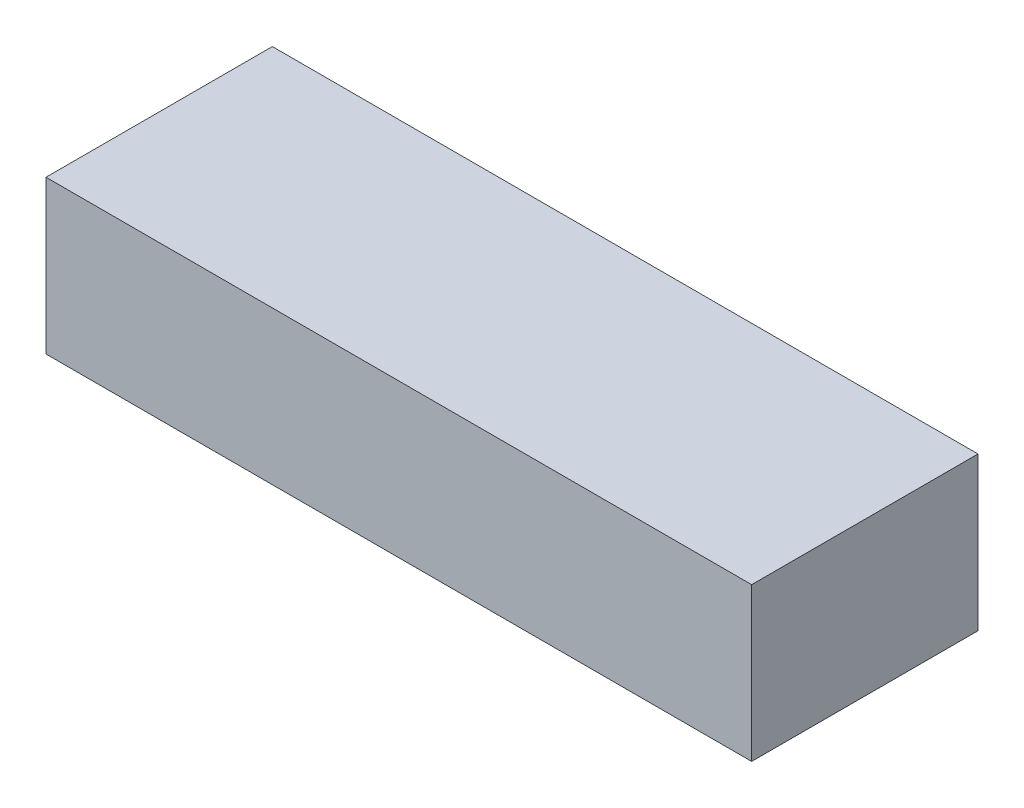
ISO-10303-21;
HEADER;
FILE_DESCRIPTION(('STEP AP214'),'2;1');
FILE_NAME('part.step','',(''),(''),'','','');
FILE_SCHEMA(('AUTOMOTIVE_DESIGN { 1 0 10303 214 1 1 1 1 }'));
ENDSEC;
DATA;
#1=APPLICATION_CONTEXT('core data for automotive mechanical design processes');
#2=APPLICATION_PROTOCOL_DEFINITION('international standard','automotive_design',2000,#1);
#3=PRODUCT_CONTEXT('',#1,'mechanical');
#4=PRODUCT('Part','Part','',(#3));
#5=PRODUCT_RELATED_PRODUCT_CATEGORY('part','',(#4));
#6=PRODUCT_DEFINITION_FORMATION('','',#4);
#7=PRODUCT_DEFINITION_CONTEXT('part definition',#1,'design');
#8=PRODUCT_DEFINITION('design','',#6,#7);
#9=PRODUCT_DEFINITION_SHAPE('','',#8);
#10=(LENGTH_UNIT() NAMED_UNIT(*) SI_UNIT(.MILLI.,.METRE.));
#11=(NAMED_UNIT(*) PLANE_ANGLE_UNIT() SI_UNIT($,.RADIAN.));
#12=(NAMED_UNIT(*) SI_UNIT($,.STERADIAN.) SOLID_ANGLE_UNIT());
#13=UNCERTAINTY_MEASURE_WITH_UNIT(LENGTH_MEASURE(1.E-05),#10,'distance_accuracy_value','');
#14=(GEOMETRIC_REPRESENTATION_CONTEXT(3) GLOBAL_UNCERTAINTY_ASSIGNED_CONTEXT((#13)) GLOBAL_UNIT_ASSIGNED_CONTEXT((#10,
#11,#12)) REPRESENTATION_CONTEXT('',''));
#15=CARTESIAN_POINT('',(0.,0.,0.));
#16=DIRECTION('',(0.,0.,1.));
#17=DIRECTION('',(1.,0.,0.));
#18=AXIS2_PLACEMENT_3D('',#15,#16,#17);
#19=CARTESIAN_POINT('',(53.,23.,-17.));
#20=DIRECTION('',(-1.,0.,0.));
#21=DIRECTION('',(0.,0.,1.));
#22=AXIS2_PLACEMENT_3D('',#19,#20,#21);
#23=PLANE('',#22);
#24=DIRECTION('',(0.,0.,-1.));
#25=VECTOR('',#24,1.);
#26=CARTESIAN_POINT('',(53.,0.,-17.));
#27=LINE('',#26,#25);
#28=CARTESIAN_POINT('',(53.,0.,17.));
#29=VERTEX_POINT('',#28);
#30=CARTESIAN_POINT('',(53.,0.,-17.));
#31=VERTEX_POINT('',#30);
#32=EDGE_CURVE('E97',#29,#31,#27,.T.);
#33=ORIENTED_EDGE('',*,*,#32,.T.);
#34=DIRECTION('',(0.,-1.,0.));
#35=VECTOR('',#34,1.);
#36=CARTESIAN_POINT('',(53.,23.,-17.));
#37=LINE('',#36,#35);
#38=CARTESIAN_POINT('',(53.,23.,-17.));
#39=VERTEX_POINT('',#38);
#40=EDGE_CURVE('E11',#39,#31,#37,.T.);
#41=ORIENTED_EDGE('',*,*,#40,.F.);
#42=DIRECTION('',(0.,0.,-1.));
#43=VECTOR('',#42,1.);
#44=CARTESIAN_POINT('',(53.,23.,-17.));
#45=LINE('',#44,#43);
#46=CARTESIAN_POINT('',(53.,23.,17.));
#47=VERTEX_POINT('',#46);
#48=EDGE_CURVE('E85',#47,#39,#45,.T.);
#49=ORIENTED_EDGE('',*,*,#48,.F.);
#50=DIRECTION('',(0.,-1.,0.));
#51=VECTOR('',#50,1.);
#52=CARTESIAN_POINT('',(53.,23.,17.));
#53=LINE('',#52,#51);
#54=EDGE_CURVE('E93',#47,#29,#53,.T.);
#55=ORIENTED_EDGE('',*,*,#54,.T.);
#56=EDGE_LOOP('',(#33,#41,#49,#55));
#57=FACE_BOUND('',#56,.T.);
#58=ADVANCED_FACE('F34',(#57),#23,.F.);
#59=CARTESIAN_POINT('',(-53.,23.,-17.));
#60=DIRECTION('',(0.,0.,1.));
#61=DIRECTION('',(1.,0.,0.));
#62=AXIS2_PLACEMENT_3D('',#59,#60,#61);
#63=PLANE('',#62);
#64=DIRECTION('',(-1.,0.,0.));
#65=VECTOR('',#64,1.);
#66=CARTESIAN_POINT('',(-53.,0.,-17.));
#67=LINE('',#66,#65);
#68=CARTESIAN_POINT('',(-53.,0.,-17.));
#69=VERTEX_POINT('',#68);
#70=EDGE_CURVE('E89',#31,#69,#67,.T.);
#71=ORIENTED_EDGE('',*,*,#70,.T.);
#72=DIRECTION('',(0.,-1.,0.));
#73=VECTOR('',#72,1.);
#74=CARTESIAN_POINT('',(-53.,23.,-17.));
#75=LINE('',#74,#73);
#76=CARTESIAN_POINT('',(-53.,23.,-17.));
#77=VERTEX_POINT('',#76);
#78=EDGE_CURVE('E42',#77,#69,#75,.T.);
#79=ORIENTED_EDGE('',*,*,#78,.F.);
#80=DIRECTION('',(-1.,0.,0.));
#81=VECTOR('',#80,1.);
#82=CARTESIAN_POINT('',(-53.,23.,-17.));
#83=LINE('',#82,#81);
#84=EDGE_CURVE('E80',#39,#77,#83,.T.);
#85=ORIENTED_EDGE('',*,*,#84,.F.);
#86=ORIENTED_EDGE('',*,*,#40,.T.);
#87=EDGE_LOOP('',(#71,#79,#85,#86));
#88=FACE_BOUND('',#87,.T.);
#89=ADVANCED_FACE('F88',(#88),#63,.F.);
#90=CARTESIAN_POINT('',(-53.,23.,-17.));
#91=DIRECTION('',(1.,0.,0.));
#92=DIRECTION('',(0.,0.,-1.));
#93=AXIS2_PLACEMENT_3D('',#90,#91,#92);
#94=PLANE('',#93);
#95=DIRECTION('',(0.,0.,1.));
#96=VECTOR('',#95,1.);
#97=CARTESIAN_POINT('',(-53.,0.,-17.));
#98=LINE('',#97,#96);
#99=CARTESIAN_POINT('',(-53.,0.,17.));
#100=VERTEX_POINT('',#99);
#101=EDGE_CURVE('E67',#69,#100,#98,.T.);
#102=ORIENTED_EDGE('',*,*,#101,.T.);
#103=DIRECTION('',(0.,-1.,0.));
#104=VECTOR('',#103,1.);
#105=CARTESIAN_POINT('',(-53.,23.,17.));
#106=LINE('',#105,#104);
#107=CARTESIAN_POINT('',(-53.,23.,17.));
#108=VERTEX_POINT('',#107);
#109=EDGE_CURVE('E90',#108,#100,#106,.T.);
#110=ORIENTED_EDGE('',*,*,#109,.F.);
#111=DIRECTION('',(0.,0.,1.));
#112=VECTOR('',#111,1.);
#113=CARTESIAN_POINT('',(-53.,23.,-17.));
#114=LINE('',#113,#112);
#115=EDGE_CURVE('E83',#77,#108,#114,.T.);
#116=ORIENTED_EDGE('',*,*,#115,.F.);
#117=ORIENTED_EDGE('',*,*,#78,.T.);
#118=EDGE_LOOP('',(#102,#110,#116,#117));
#119=FACE_BOUND('',#118,.T.);
#120=ADVANCED_FACE('F91',(#119),#94,.F.);
#121=CARTESIAN_POINT('',(-53.,23.,17.));
#122=DIRECTION('',(0.,0.,-1.));
#123=DIRECTION('',(-1.,0.,0.));
#124=AXIS2_PLACEMENT_3D('',#121,#122,#123);
#125=PLANE('',#124);
#126=DIRECTION('',(1.,0.,0.));
#127=VECTOR('',#126,1.);
#128=CARTESIAN_POINT('',(-53.,0.,17.));
#129=LINE('',#128,#127);
#130=EDGE_CURVE('E73',#100,#29,#129,.T.);
#131=ORIENTED_EDGE('',*,*,#130,.T.);
#132=ORIENTED_EDGE('',*,*,#54,.F.);
#133=DIRECTION('',(1.,0.,0.));
#134=VECTOR('',#133,1.);
#135=CARTESIAN_POINT('',(-53.,23.,17.));
#136=LINE('',#135,#134);
#137=EDGE_CURVE('E50',#108,#47,#136,.T.);
#138=ORIENTED_EDGE('',*,*,#137,.F.);
#139=ORIENTED_EDGE('',*,*,#109,.T.);
#140=EDGE_LOOP('',(#131,#132,#138,#139));
#141=FACE_BOUND('',#140,.T.);
#142=ADVANCED_FACE('F104',(#141),#125,.F.);
#143=CARTESIAN_POINT('',(0.,23.,0.));
#144=DIRECTION('',(0.,1.,0.));
#145=DIRECTION('',(0.,0.,1.));
#146=AXIS2_PLACEMENT_3D('',#143,#144,#145);
#147=PLANE('',#146);
#148=ORIENTED_EDGE('',*,*,#48,.T.);
#149=ORIENTED_EDGE('',*,*,#84,.T.);
#150=ORIENTED_EDGE('',*,*,#115,.T.);
#151=ORIENTED_EDGE('',*,*,#137,.T.);
#152=EDGE_LOOP('',(#148,#149,#150,#151));
#153=FACE_BOUND('',#152,.T.);
#154=ADVANCED_FACE('F81',(#153),#147,.T.);
#155=CARTESIAN_POINT('',(0.,0.,0.));
#156=DIRECTION('',(0.,1.,0.));
#157=DIRECTION('',(0.,0.,1.));
#158=AXIS2_PLACEMENT_3D('',#155,#156,#157);
#159=PLANE('',#158);
#160=ORIENTED_EDGE('',*,*,#32,.F.);
#161=ORIENTED_EDGE('',*,*,#130,.F.);
#162=ORIENTED_EDGE('',*,*,#101,.F.);
#163=ORIENTED_EDGE('',*,*,#70,.F.);
#164=EDGE_LOOP('',(#160,#161,#162,#163));
#165=FACE_BOUND('',#164,.T.);
#166=ADVANCED_FACE('F107',(#165),#159,.F.);
#167=CLOSED_SHELL('',(#58,#89,#120,#142,#154,#166));
#168=MANIFOLD_SOLID_BREP('B2',#167);
#169=ADVANCED_BREP_SHAPE_REPRESENTATION('',(#18,#168),#14);
#170=SHAPE_DEFINITION_REPRESENTATION(#9,#169);
ENDSEC;
END-ISO-10303-21;
